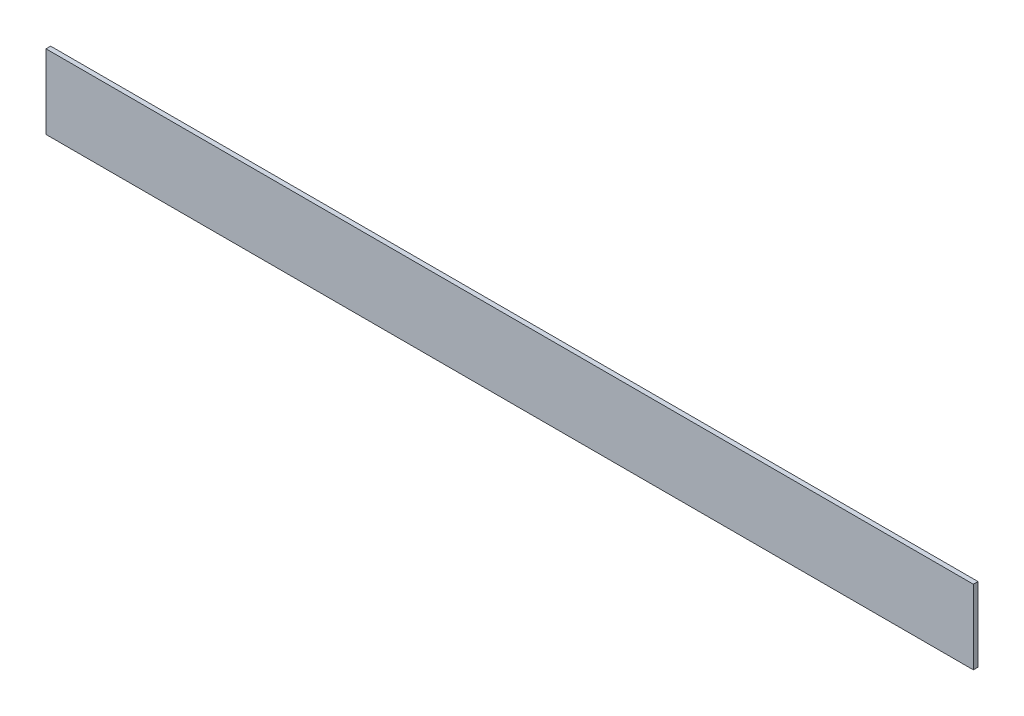
ISO-10303-21;
HEADER;
FILE_DESCRIPTION(('STEP AP214'),'2;1');
FILE_NAME('part.step','',(''),(''),'','','');
FILE_SCHEMA(('AUTOMOTIVE_DESIGN { 1 0 10303 214 1 1 1 1 }'));
ENDSEC;
DATA;
#1=APPLICATION_CONTEXT('core data for automotive mechanical design processes');
#2=APPLICATION_PROTOCOL_DEFINITION('international standard','automotive_design',2000,#1);
#3=PRODUCT_CONTEXT('',#1,'mechanical');
#4=PRODUCT('Part','Part','',(#3));
#5=PRODUCT_RELATED_PRODUCT_CATEGORY('part','',(#4));
#6=PRODUCT_DEFINITION_FORMATION('','',#4);
#7=PRODUCT_DEFINITION_CONTEXT('part definition',#1,'design');
#8=PRODUCT_DEFINITION('design','',#6,#7);
#9=PRODUCT_DEFINITION_SHAPE('','',#8);
#10=(LENGTH_UNIT() NAMED_UNIT(*) SI_UNIT(.MILLI.,.METRE.));
#11=(NAMED_UNIT(*) PLANE_ANGLE_UNIT() SI_UNIT($,.RADIAN.));
#12=(NAMED_UNIT(*) SI_UNIT($,.STERADIAN.) SOLID_ANGLE_UNIT());
#13=UNCERTAINTY_MEASURE_WITH_UNIT(LENGTH_MEASURE(1.E-05),#10,'distance_accuracy_value','');
#14=(GEOMETRIC_REPRESENTATION_CONTEXT(3) GLOBAL_UNCERTAINTY_ASSIGNED_CONTEXT((#13)) GLOBAL_UNIT_ASSIGNED_CONTEXT((#10,
#11,#12)) REPRESENTATION_CONTEXT('',''));
#15=CARTESIAN_POINT('',(0.,0.,0.));
#16=DIRECTION('',(0.,0.,1.));
#17=DIRECTION('',(1.,0.,0.));
#18=AXIS2_PLACEMENT_3D('',#15,#16,#17);
#19=CARTESIAN_POINT('',(0.,0.,1.5875));
#20=DIRECTION('',(-1.,0.,0.));
#21=DIRECTION('',(0.,-1.,0.));
#22=AXIS2_PLACEMENT_3D('',#19,#20,#21);
#23=PLANE('',#22);
#24=DIRECTION('',(0.,1.,0.));
#25=VECTOR('',#24,1.);
#26=CARTESIAN_POINT('',(0.,0.,0.));
#27=LINE('',#26,#25);
#28=CARTESIAN_POINT('',(0.,-25.4,0.));
#29=VERTEX_POINT('',#28);
#30=CARTESIAN_POINT('',(0.,0.,0.));
#31=VERTEX_POINT('',#30);
#32=EDGE_CURVE('E96',#29,#31,#27,.T.);
#33=ORIENTED_EDGE('',*,*,#32,.T.);
#34=DIRECTION('',(0.,0.,-1.));
#35=VECTOR('',#34,1.);
#36=CARTESIAN_POINT('',(0.,0.,1.5875));
#37=LINE('',#36,#35);
#38=CARTESIAN_POINT('',(0.,0.,1.5875));
#39=VERTEX_POINT('',#38);
#40=EDGE_CURVE('E11',#39,#31,#37,.T.);
#41=ORIENTED_EDGE('',*,*,#40,.F.);
#42=DIRECTION('',(0.,1.,0.));
#43=VECTOR('',#42,1.);
#44=CARTESIAN_POINT('',(0.,0.,1.5875));
#45=LINE('',#44,#43);
#46=CARTESIAN_POINT('',(0.,-25.4,1.5875));
#47=VERTEX_POINT('',#46);
#48=EDGE_CURVE('E84',#47,#39,#45,.T.);
#49=ORIENTED_EDGE('',*,*,#48,.F.);
#50=DIRECTION('',(0.,0.,-1.));
#51=VECTOR('',#50,1.);
#52=CARTESIAN_POINT('',(0.,-25.4,1.5875));
#53=LINE('',#52,#51);
#54=EDGE_CURVE('E92',#47,#29,#53,.T.);
#55=ORIENTED_EDGE('',*,*,#54,.T.);
#56=EDGE_LOOP('',(#33,#41,#49,#55));
#57=FACE_BOUND('',#56,.T.);
#58=ADVANCED_FACE('F33',(#57),#23,.F.);
#59=CARTESIAN_POINT('',(0.,0.,1.5875));
#60=DIRECTION('',(0.,-1.,0.));
#61=DIRECTION('',(1.,0.,0.));
#62=AXIS2_PLACEMENT_3D('',#59,#60,#61);
#63=PLANE('',#62);
#64=DIRECTION('',(-1.,0.,0.));
#65=VECTOR('',#64,1.);
#66=CARTESIAN_POINT('',(0.,0.,0.));
#67=LINE('',#66,#65);
#68=CARTESIAN_POINT('',(-317.5,0.,0.));
#69=VERTEX_POINT('',#68);
#70=EDGE_CURVE('E88',#31,#69,#67,.T.);
#71=ORIENTED_EDGE('',*,*,#70,.T.);
#72=DIRECTION('',(0.,0.,-1.));
#73=VECTOR('',#72,1.);
#74=CARTESIAN_POINT('',(-317.5,0.,1.5875));
#75=LINE('',#74,#73);
#76=CARTESIAN_POINT('',(-317.5,0.,1.5875));
#77=VERTEX_POINT('',#76);
#78=EDGE_CURVE('E41',#77,#69,#75,.T.);
#79=ORIENTED_EDGE('',*,*,#78,.F.);
#80=DIRECTION('',(-1.,0.,0.));
#81=VECTOR('',#80,1.);
#82=CARTESIAN_POINT('',(0.,0.,1.5875));
#83=LINE('',#82,#81);
#84=EDGE_CURVE('E79',#39,#77,#83,.T.);
#85=ORIENTED_EDGE('',*,*,#84,.F.);
#86=ORIENTED_EDGE('',*,*,#40,.T.);
#87=EDGE_LOOP('',(#71,#79,#85,#86));
#88=FACE_BOUND('',#87,.T.);
#89=ADVANCED_FACE('F87',(#88),#63,.F.);
#90=CARTESIAN_POINT('',(-317.5,0.,1.5875));
#91=DIRECTION('',(1.,0.,0.));
#92=DIRECTION('',(0.,0.,-1.));
#93=AXIS2_PLACEMENT_3D('',#90,#91,#92);
#94=PLANE('',#93);
#95=DIRECTION('',(0.,-1.,0.));
#96=VECTOR('',#95,1.);
#97=CARTESIAN_POINT('',(-317.5,0.,0.));
#98=LINE('',#97,#96);
#99=CARTESIAN_POINT('',(-317.5,-25.4,0.));
#100=VERTEX_POINT('',#99);
#101=EDGE_CURVE('E66',#69,#100,#98,.T.);
#102=ORIENTED_EDGE('',*,*,#101,.T.);
#103=DIRECTION('',(0.,0.,-1.));
#104=VECTOR('',#103,1.);
#105=CARTESIAN_POINT('',(-317.5,-25.4,1.5875));
#106=LINE('',#105,#104);
#107=CARTESIAN_POINT('',(-317.5,-25.4,1.5875));
#108=VERTEX_POINT('',#107);
#109=EDGE_CURVE('E89',#108,#100,#106,.T.);
#110=ORIENTED_EDGE('',*,*,#109,.F.);
#111=DIRECTION('',(0.,-1.,0.));
#112=VECTOR('',#111,1.);
#113=CARTESIAN_POINT('',(-317.5,0.,1.5875));
#114=LINE('',#113,#112);
#115=EDGE_CURVE('E82',#77,#108,#114,.T.);
#116=ORIENTED_EDGE('',*,*,#115,.F.);
#117=ORIENTED_EDGE('',*,*,#78,.T.);
#118=EDGE_LOOP('',(#102,#110,#116,#117));
#119=FACE_BOUND('',#118,.T.);
#120=ADVANCED_FACE('F90',(#119),#94,.F.);
#121=CARTESIAN_POINT('',(0.,-25.4,1.5875));
#122=DIRECTION('',(0.,1.,0.));
#123=DIRECTION('',(-1.,0.,0.));
#124=AXIS2_PLACEMENT_3D('',#121,#122,#123);
#125=PLANE('',#124);
#126=DIRECTION('',(1.,0.,0.));
#127=VECTOR('',#126,1.);
#128=CARTESIAN_POINT('',(0.,-25.4,0.));
#129=LINE('',#128,#127);
#130=EDGE_CURVE('E72',#100,#29,#129,.T.);
#131=ORIENTED_EDGE('',*,*,#130,.T.);
#132=ORIENTED_EDGE('',*,*,#54,.F.);
#133=DIRECTION('',(1.,0.,0.));
#134=VECTOR('',#133,1.);
#135=CARTESIAN_POINT('',(0.,-25.4,1.5875));
#136=LINE('',#135,#134);
#137=EDGE_CURVE('E49',#108,#47,#136,.T.);
#138=ORIENTED_EDGE('',*,*,#137,.F.);
#139=ORIENTED_EDGE('',*,*,#109,.T.);
#140=EDGE_LOOP('',(#131,#132,#138,#139));
#141=FACE_BOUND('',#140,.T.);
#142=ADVANCED_FACE('F103',(#141),#125,.F.);
#143=CARTESIAN_POINT('',(0.,0.,1.5875));
#144=DIRECTION('',(0.,0.,-1.));
#145=DIRECTION('',(-1.,0.,0.));
#146=AXIS2_PLACEMENT_3D('',#143,#144,#145);
#147=PLANE('',#146);
#148=ORIENTED_EDGE('',*,*,#48,.T.);
#149=ORIENTED_EDGE('',*,*,#84,.T.);
#150=ORIENTED_EDGE('',*,*,#115,.T.);
#151=ORIENTED_EDGE('',*,*,#137,.T.);
#152=EDGE_LOOP('',(#148,#149,#150,#151));
#153=FACE_BOUND('',#152,.T.);
#154=ADVANCED_FACE('F80',(#153),#147,.F.);
#155=CARTESIAN_POINT('',(0.,0.,0.));
#156=DIRECTION('',(0.,0.,-1.));
#157=DIRECTION('',(-1.,0.,0.));
#158=AXIS2_PLACEMENT_3D('',#155,#156,#157);
#159=PLANE('',#158);
#160=ORIENTED_EDGE('',*,*,#32,.F.);
#161=ORIENTED_EDGE('',*,*,#130,.F.);
#162=ORIENTED_EDGE('',*,*,#101,.F.);
#163=ORIENTED_EDGE('',*,*,#70,.F.);
#164=EDGE_LOOP('',(#160,#161,#162,#163));
#165=FACE_BOUND('',#164,.T.);
#166=ADVANCED_FACE('F106',(#165),#159,.T.);
#167=CLOSED_SHELL('',(#58,#89,#120,#142,#154,#166));
#168=MANIFOLD_SOLID_BREP('B2',#167);
#169=ADVANCED_BREP_SHAPE_REPRESENTATION('',(#18,#168),#14);
#170=SHAPE_DEFINITION_REPRESENTATION(#9,#169);
ENDSEC;
END-ISO-10303-21;
